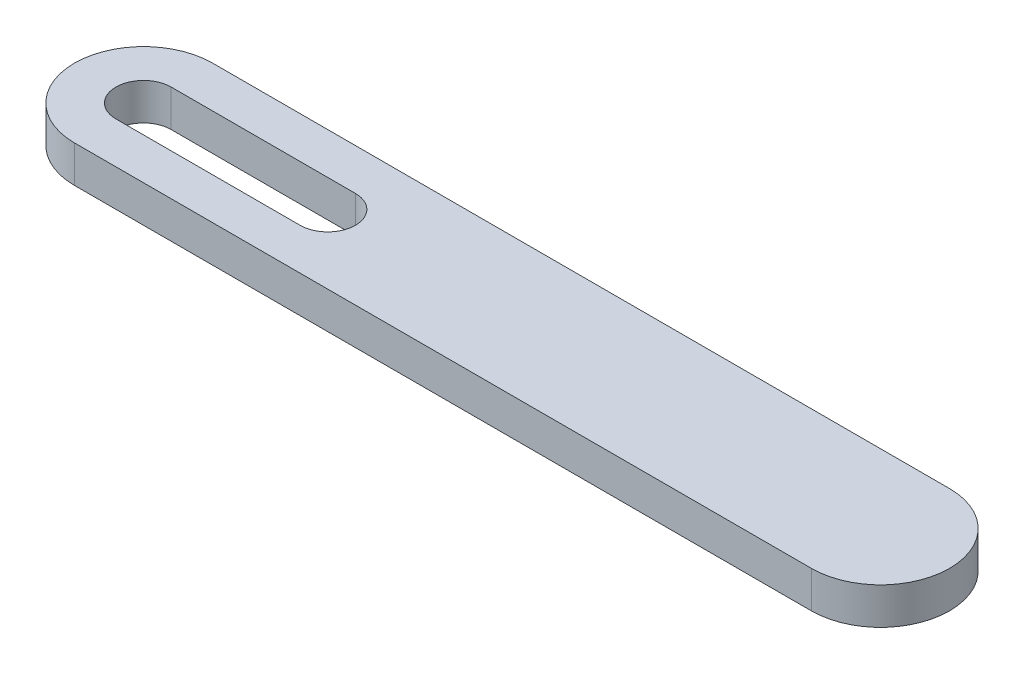
ISO-10303-21;
HEADER;
FILE_DESCRIPTION(('STEP AP214'),'2;1');
FILE_NAME('part.step','',(''),(''),'','','');
FILE_SCHEMA(('AUTOMOTIVE_DESIGN { 1 0 10303 214 1 1 1 1 }'));
ENDSEC;
DATA;
#1=APPLICATION_CONTEXT('core data for automotive mechanical design processes');
#2=APPLICATION_PROTOCOL_DEFINITION('international standard','automotive_design',2000,#1);
#3=PRODUCT_CONTEXT('',#1,'mechanical');
#4=PRODUCT('Part','Part','',(#3));
#5=PRODUCT_RELATED_PRODUCT_CATEGORY('part','',(#4));
#6=PRODUCT_DEFINITION_FORMATION('','',#4);
#7=PRODUCT_DEFINITION_CONTEXT('part definition',#1,'design');
#8=PRODUCT_DEFINITION('design','',#6,#7);
#9=PRODUCT_DEFINITION_SHAPE('','',#8);
#10=(LENGTH_UNIT() NAMED_UNIT(*) SI_UNIT(.MILLI.,.METRE.));
#11=(NAMED_UNIT(*) PLANE_ANGLE_UNIT() SI_UNIT($,.RADIAN.));
#12=(NAMED_UNIT(*) SI_UNIT($,.STERADIAN.) SOLID_ANGLE_UNIT());
#13=UNCERTAINTY_MEASURE_WITH_UNIT(LENGTH_MEASURE(1.E-05),#10,'distance_accuracy_value','');
#14=(GEOMETRIC_REPRESENTATION_CONTEXT(3) GLOBAL_UNCERTAINTY_ASSIGNED_CONTEXT((#13)) GLOBAL_UNIT_ASSIGNED_CONTEXT((#10,
#11,#12)) REPRESENTATION_CONTEXT('',''));
#15=CARTESIAN_POINT('',(0.,0.,0.));
#16=DIRECTION('',(0.,0.,1.));
#17=DIRECTION('',(1.,0.,0.));
#18=AXIS2_PLACEMENT_3D('',#15,#16,#17);
#19=CARTESIAN_POINT('',(0.,20.,-37.5));
#20=DIRECTION('',(0.,1.,0.));
#21=DIRECTION('',(0.,0.,1.));
#22=AXIS2_PLACEMENT_3D('',#19,#20,#21);
#23=PLANE('',#22);
#24=CARTESIAN_POINT('',(0.,20.,-37.5));
#25=DIRECTION('',(0.,1.,0.));
#26=DIRECTION('',(0.,0.,1.));
#27=AXIS2_PLACEMENT_3D('',#24,#25,#26);
#28=CIRCLE('',#27,37.5);
#29=CARTESIAN_POINT('',(0.,20.,-75.));
#30=VERTEX_POINT('',#29);
#31=CARTESIAN_POINT('',(0.,20.,0.));
#32=VERTEX_POINT('',#31);
#33=EDGE_CURVE('E137',#30,#32,#28,.T.);
#34=ORIENTED_EDGE('',*,*,#33,.T.);
#35=DIRECTION('',(1.,0.,0.));
#36=VECTOR('',#35,1.);
#37=CARTESIAN_POINT('',(0.,20.,0.));
#38=LINE('',#37,#36);
#39=CARTESIAN_POINT('',(400.,20.,0.));
#40=VERTEX_POINT('',#39);
#41=EDGE_CURVE('E140',#32,#40,#38,.T.);
#42=ORIENTED_EDGE('',*,*,#41,.T.);
#43=CARTESIAN_POINT('',(400.,20.,-37.5));
#44=DIRECTION('',(0.,1.,0.));
#45=DIRECTION('',(0.,0.,-1.));
#46=AXIS2_PLACEMENT_3D('',#43,#44,#45);
#47=CIRCLE('',#46,37.5);
#48=CARTESIAN_POINT('',(400.,20.,-75.));
#49=VERTEX_POINT('',#48);
#50=EDGE_CURVE('E143',#40,#49,#47,.T.);
#51=ORIENTED_EDGE('',*,*,#50,.T.);
#52=DIRECTION('',(-1.,0.,0.));
#53=VECTOR('',#52,1.);
#54=CARTESIAN_POINT('',(0.,20.,-75.));
#55=LINE('',#54,#53);
#56=EDGE_CURVE('E145',#49,#30,#55,.T.);
#57=ORIENTED_EDGE('',*,*,#56,.T.);
#58=EDGE_LOOP('',(#34,#42,#51,#57));
#59=FACE_BOUND('',#58,.T.);
#60=DIRECTION('',(1.,0.,0.));
#61=VECTOR('',#60,1.);
#62=CARTESIAN_POINT('',(0.,20.,-22.5));
#63=LINE('',#62,#61);
#64=CARTESIAN_POINT('',(0.,20.,-22.5));
#65=VERTEX_POINT('',#64);
#66=CARTESIAN_POINT('',(100.,20.,-22.5));
#67=VERTEX_POINT('',#66);
#68=EDGE_CURVE('E109',#65,#67,#63,.T.);
#69=ORIENTED_EDGE('',*,*,#68,.F.);
#70=CARTESIAN_POINT('',(0.,20.,-37.5));
#71=DIRECTION('',(0.,1.,0.));
#72=DIRECTION('',(0.,0.,1.));
#73=AXIS2_PLACEMENT_3D('',#70,#71,#72);
#74=CIRCLE('',#73,15.);
#75=CARTESIAN_POINT('',(0.,20.,-52.5));
#76=VERTEX_POINT('',#75);
#77=EDGE_CURVE('E101',#76,#65,#74,.T.);
#78=ORIENTED_EDGE('',*,*,#77,.F.);
#79=DIRECTION('',(-1.,0.,0.));
#80=VECTOR('',#79,1.);
#81=CARTESIAN_POINT('',(0.,20.,-52.5));
#82=LINE('',#81,#80);
#83=CARTESIAN_POINT('',(100.,20.,-52.5));
#84=VERTEX_POINT('',#83);
#85=EDGE_CURVE('E123',#84,#76,#82,.T.);
#86=ORIENTED_EDGE('',*,*,#85,.F.);
#87=CARTESIAN_POINT('',(100.,20.,-37.5));
#88=DIRECTION('',(0.,1.,0.));
#89=DIRECTION('',(0.,0.,1.));
#90=AXIS2_PLACEMENT_3D('',#87,#88,#89);
#91=CIRCLE('',#90,15.);
#92=EDGE_CURVE('E121',#67,#84,#91,.T.);
#93=ORIENTED_EDGE('',*,*,#92,.F.);
#94=EDGE_LOOP('',(#69,#78,#86,#93));
#95=FACE_BOUND('',#94,.T.);
#96=ADVANCED_FACE('F36',(#59,#95),#23,.T.);
#97=CARTESIAN_POINT('',(0.,0.,-37.5));
#98=DIRECTION('',(0.,1.,0.));
#99=DIRECTION('',(0.,0.,1.));
#100=AXIS2_PLACEMENT_3D('',#97,#98,#99);
#101=PLANE('',#100);
#102=CARTESIAN_POINT('',(0.,0.,-37.5));
#103=DIRECTION('',(0.,1.,0.));
#104=DIRECTION('',(0.,0.,1.));
#105=AXIS2_PLACEMENT_3D('',#102,#103,#104);
#106=CIRCLE('',#105,37.5);
#107=CARTESIAN_POINT('',(0.,0.,-75.));
#108=VERTEX_POINT('',#107);
#109=CARTESIAN_POINT('',(0.,0.,0.));
#110=VERTEX_POINT('',#109);
#111=EDGE_CURVE('E117',#108,#110,#106,.T.);
#112=ORIENTED_EDGE('',*,*,#111,.F.);
#113=DIRECTION('',(-1.,0.,0.));
#114=VECTOR('',#113,1.);
#115=CARTESIAN_POINT('',(0.,0.,-75.));
#116=LINE('',#115,#114);
#117=CARTESIAN_POINT('',(400.,0.,-75.));
#118=VERTEX_POINT('',#117);
#119=EDGE_CURVE('E141',#118,#108,#116,.T.);
#120=ORIENTED_EDGE('',*,*,#119,.F.);
#121=CARTESIAN_POINT('',(400.,0.,-37.5));
#122=DIRECTION('',(0.,1.,0.));
#123=DIRECTION('',(0.,0.,-1.));
#124=AXIS2_PLACEMENT_3D('',#121,#122,#123);
#125=CIRCLE('',#124,37.5);
#126=CARTESIAN_POINT('',(400.,0.,0.));
#127=VERTEX_POINT('',#126);
#128=EDGE_CURVE('E152',#127,#118,#125,.T.);
#129=ORIENTED_EDGE('',*,*,#128,.F.);
#130=DIRECTION('',(1.,0.,0.));
#131=VECTOR('',#130,1.);
#132=CARTESIAN_POINT('',(0.,0.,0.));
#133=LINE('',#132,#131);
#134=EDGE_CURVE('E150',#110,#127,#133,.T.);
#135=ORIENTED_EDGE('',*,*,#134,.F.);
#136=EDGE_LOOP('',(#112,#120,#129,#135));
#137=FACE_BOUND('',#136,.T.);
#138=CARTESIAN_POINT('',(0.,0.,-37.5));
#139=DIRECTION('',(0.,1.,0.));
#140=DIRECTION('',(0.,0.,1.));
#141=AXIS2_PLACEMENT_3D('',#138,#139,#140);
#142=CIRCLE('',#141,15.);
#143=CARTESIAN_POINT('',(0.,0.,-52.5));
#144=VERTEX_POINT('',#143);
#145=CARTESIAN_POINT('',(0.,0.,-22.5));
#146=VERTEX_POINT('',#145);
#147=EDGE_CURVE('E59',#144,#146,#142,.T.);
#148=ORIENTED_EDGE('',*,*,#147,.T.);
#149=DIRECTION('',(1.,0.,0.));
#150=VECTOR('',#149,1.);
#151=CARTESIAN_POINT('',(0.,0.,-22.5));
#152=LINE('',#151,#150);
#153=CARTESIAN_POINT('',(100.,0.,-22.5));
#154=VERTEX_POINT('',#153);
#155=EDGE_CURVE('E116',#146,#154,#152,.T.);
#156=ORIENTED_EDGE('',*,*,#155,.T.);
#157=CARTESIAN_POINT('',(100.,0.,-37.5));
#158=DIRECTION('',(0.,1.,0.));
#159=DIRECTION('',(0.,0.,1.));
#160=AXIS2_PLACEMENT_3D('',#157,#158,#159);
#161=CIRCLE('',#160,15.);
#162=CARTESIAN_POINT('',(100.,0.,-52.5));
#163=VERTEX_POINT('',#162);
#164=EDGE_CURVE('E129',#154,#163,#161,.T.);
#165=ORIENTED_EDGE('',*,*,#164,.T.);
#166=DIRECTION('',(-1.,0.,0.));
#167=VECTOR('',#166,1.);
#168=CARTESIAN_POINT('',(0.,0.,-52.5));
#169=LINE('',#168,#167);
#170=EDGE_CURVE('E110',#163,#144,#169,.T.);
#171=ORIENTED_EDGE('',*,*,#170,.T.);
#172=EDGE_LOOP('',(#148,#156,#165,#171));
#173=FACE_BOUND('',#172,.T.);
#174=ADVANCED_FACE('F170',(#137,#173),#101,.F.);
#175=CARTESIAN_POINT('',(0.,20.,-37.5));
#176=DIRECTION('',(0.,-1.,0.));
#177=DIRECTION('',(0.,0.,-1.));
#178=AXIS2_PLACEMENT_3D('',#175,#176,#177);
#179=CYLINDRICAL_SURFACE('',#178,37.5);
#180=ORIENTED_EDGE('',*,*,#111,.T.);
#181=DIRECTION('',(0.,-1.,0.));
#182=VECTOR('',#181,1.);
#183=CARTESIAN_POINT('',(0.,20.,0.));
#184=LINE('',#183,#182);
#185=EDGE_CURVE('E11',#32,#110,#184,.T.);
#186=ORIENTED_EDGE('',*,*,#185,.F.);
#187=ORIENTED_EDGE('',*,*,#33,.F.);
#188=DIRECTION('',(0.,-1.,0.));
#189=VECTOR('',#188,1.);
#190=CARTESIAN_POINT('',(0.,20.,-75.));
#191=LINE('',#190,#189);
#192=EDGE_CURVE('E147',#30,#108,#191,.T.);
#193=ORIENTED_EDGE('',*,*,#192,.T.);
#194=EDGE_LOOP('',(#180,#186,#187,#193));
#195=FACE_BOUND('',#194,.T.);
#196=ADVANCED_FACE('F38',(#195),#179,.T.);
#197=CARTESIAN_POINT('',(0.,20.,0.));
#198=DIRECTION('',(0.,0.,-1.));
#199=DIRECTION('',(-1.,0.,0.));
#200=AXIS2_PLACEMENT_3D('',#197,#198,#199);
#201=PLANE('',#200);
#202=ORIENTED_EDGE('',*,*,#134,.T.);
#203=DIRECTION('',(0.,-1.,0.));
#204=VECTOR('',#203,1.);
#205=CARTESIAN_POINT('',(400.,20.,0.));
#206=LINE('',#205,#204);
#207=EDGE_CURVE('E44',#40,#127,#206,.T.);
#208=ORIENTED_EDGE('',*,*,#207,.F.);
#209=ORIENTED_EDGE('',*,*,#41,.F.);
#210=ORIENTED_EDGE('',*,*,#185,.T.);
#211=EDGE_LOOP('',(#202,#208,#209,#210));
#212=FACE_BOUND('',#211,.T.);
#213=ADVANCED_FACE('F180',(#212),#201,.F.);
#214=CARTESIAN_POINT('',(400.,20.,-37.5));
#215=DIRECTION('',(0.,-1.,0.));
#216=DIRECTION('',(0.,0.,-1.));
#217=AXIS2_PLACEMENT_3D('',#214,#215,#216);
#218=CYLINDRICAL_SURFACE('',#217,37.5);
#219=ORIENTED_EDGE('',*,*,#128,.T.);
#220=DIRECTION('',(0.,-1.,0.));
#221=VECTOR('',#220,1.);
#222=CARTESIAN_POINT('',(400.,20.,-75.));
#223=LINE('',#222,#221);
#224=EDGE_CURVE('E157',#49,#118,#223,.T.);
#225=ORIENTED_EDGE('',*,*,#224,.F.);
#226=ORIENTED_EDGE('',*,*,#50,.F.);
#227=ORIENTED_EDGE('',*,*,#207,.T.);
#228=EDGE_LOOP('',(#219,#225,#226,#227));
#229=FACE_BOUND('',#228,.T.);
#230=ADVANCED_FACE('F164',(#229),#218,.T.);
#231=CARTESIAN_POINT('',(0.,20.,-75.));
#232=DIRECTION('',(0.,0.,1.));
#233=DIRECTION('',(1.,0.,0.));
#234=AXIS2_PLACEMENT_3D('',#231,#232,#233);
#235=PLANE('',#234);
#236=ORIENTED_EDGE('',*,*,#119,.T.);
#237=ORIENTED_EDGE('',*,*,#192,.F.);
#238=ORIENTED_EDGE('',*,*,#56,.F.);
#239=ORIENTED_EDGE('',*,*,#224,.T.);
#240=EDGE_LOOP('',(#236,#237,#238,#239));
#241=FACE_BOUND('',#240,.T.);
#242=ADVANCED_FACE('F174',(#241),#235,.F.);
#243=CARTESIAN_POINT('',(0.,20.,-37.5));
#244=DIRECTION('',(0.,-1.,0.));
#245=DIRECTION('',(0.,0.,-1.));
#246=AXIS2_PLACEMENT_3D('',#243,#244,#245);
#247=CYLINDRICAL_SURFACE('',#246,15.);
#248=ORIENTED_EDGE('',*,*,#147,.F.);
#249=DIRECTION('',(0.,-1.,0.));
#250=VECTOR('',#249,1.);
#251=CARTESIAN_POINT('',(0.,20.,-52.5));
#252=LINE('',#251,#250);
#253=EDGE_CURVE('E105',#76,#144,#252,.T.);
#254=ORIENTED_EDGE('',*,*,#253,.F.);
#255=ORIENTED_EDGE('',*,*,#77,.T.);
#256=DIRECTION('',(0.,-1.,0.));
#257=VECTOR('',#256,1.);
#258=CARTESIAN_POINT('',(0.,20.,-22.5));
#259=LINE('',#258,#257);
#260=EDGE_CURVE('E104',#65,#146,#259,.T.);
#261=ORIENTED_EDGE('',*,*,#260,.T.);
#262=EDGE_LOOP('',(#248,#254,#255,#261));
#263=FACE_BOUND('',#262,.T.);
#264=ADVANCED_FACE('F103',(#263),#247,.F.);
#265=CARTESIAN_POINT('',(0.,20.,-22.5));
#266=DIRECTION('',(0.,0.,-1.));
#267=DIRECTION('',(-1.,0.,0.));
#268=AXIS2_PLACEMENT_3D('',#265,#266,#267);
#269=PLANE('',#268);
#270=ORIENTED_EDGE('',*,*,#155,.F.);
#271=ORIENTED_EDGE('',*,*,#260,.F.);
#272=ORIENTED_EDGE('',*,*,#68,.T.);
#273=DIRECTION('',(0.,-1.,0.));
#274=VECTOR('',#273,1.);
#275=CARTESIAN_POINT('',(100.,20.,-22.5));
#276=LINE('',#275,#274);
#277=EDGE_CURVE('E118',#67,#154,#276,.T.);
#278=ORIENTED_EDGE('',*,*,#277,.T.);
#279=EDGE_LOOP('',(#270,#271,#272,#278));
#280=FACE_BOUND('',#279,.T.);
#281=ADVANCED_FACE('F113',(#280),#269,.T.);
#282=CARTESIAN_POINT('',(100.,20.,-37.5));
#283=DIRECTION('',(0.,-1.,0.));
#284=DIRECTION('',(0.,0.,-1.));
#285=AXIS2_PLACEMENT_3D('',#282,#283,#284);
#286=CYLINDRICAL_SURFACE('',#285,15.);
#287=ORIENTED_EDGE('',*,*,#164,.F.);
#288=ORIENTED_EDGE('',*,*,#277,.F.);
#289=ORIENTED_EDGE('',*,*,#92,.T.);
#290=DIRECTION('',(0.,-1.,0.));
#291=VECTOR('',#290,1.);
#292=CARTESIAN_POINT('',(100.,20.,-52.5));
#293=LINE('',#292,#291);
#294=EDGE_CURVE('E51',#84,#163,#293,.T.);
#295=ORIENTED_EDGE('',*,*,#294,.T.);
#296=EDGE_LOOP('',(#287,#288,#289,#295));
#297=FACE_BOUND('',#296,.T.);
#298=ADVANCED_FACE('F203',(#297),#286,.F.);
#299=CARTESIAN_POINT('',(0.,20.,-52.5));
#300=DIRECTION('',(0.,0.,1.));
#301=DIRECTION('',(1.,0.,0.));
#302=AXIS2_PLACEMENT_3D('',#299,#300,#301);
#303=PLANE('',#302);
#304=ORIENTED_EDGE('',*,*,#170,.F.);
#305=ORIENTED_EDGE('',*,*,#294,.F.);
#306=ORIENTED_EDGE('',*,*,#85,.T.);
#307=ORIENTED_EDGE('',*,*,#253,.T.);
#308=EDGE_LOOP('',(#304,#305,#306,#307));
#309=FACE_BOUND('',#308,.T.);
#310=ADVANCED_FACE('F207',(#309),#303,.T.);
#311=CLOSED_SHELL('',(#96,#174,#196,#213,#230,#242,#264,#281,#298,#310));
#312=MANIFOLD_SOLID_BREP('B2',#311);
#313=ADVANCED_BREP_SHAPE_REPRESENTATION('',(#18,#312),#14);
#314=SHAPE_DEFINITION_REPRESENTATION(#9,#313);
ENDSEC;
END-ISO-10303-21;
